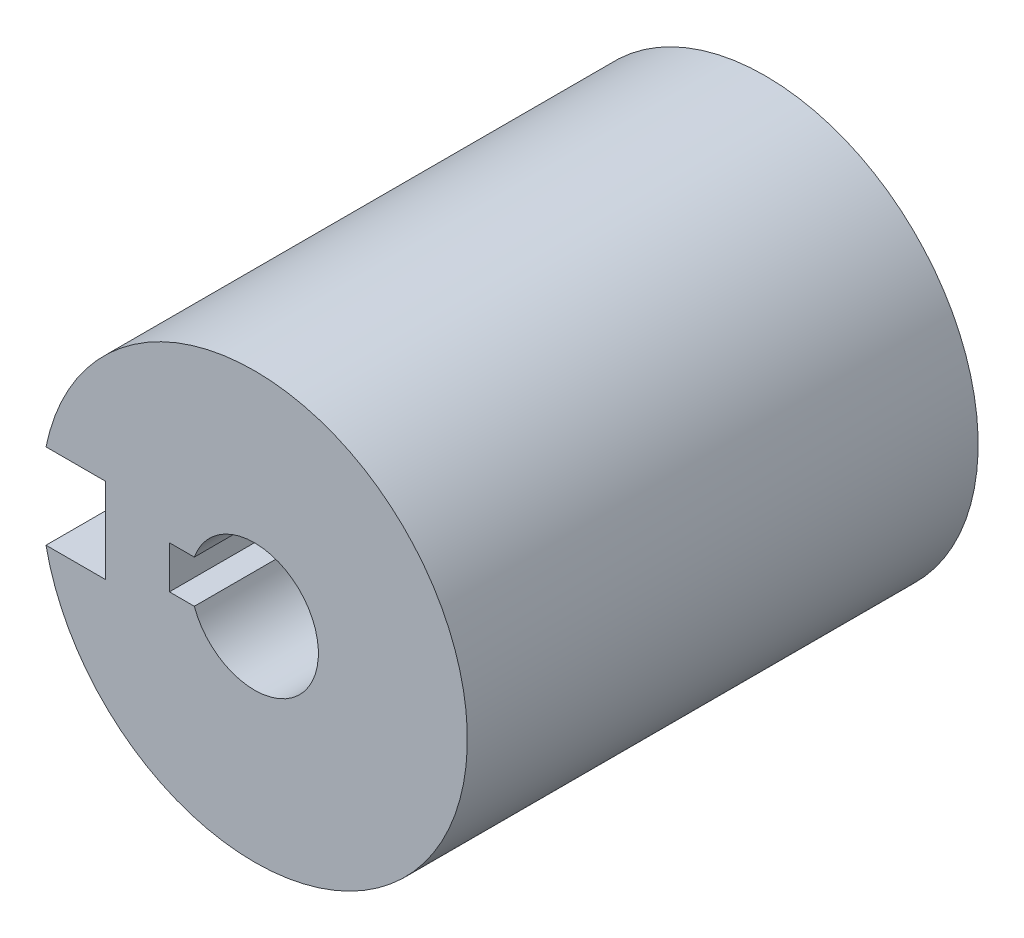
ISO-10303-21;
HEADER;
FILE_DESCRIPTION(('STEP AP214'),'2;1');
FILE_NAME('part.step','',(''),(''),'','','');
FILE_SCHEMA(('AUTOMOTIVE_DESIGN { 1 0 10303 214 1 1 1 1 }'));
ENDSEC;
DATA;
#1=APPLICATION_CONTEXT('core data for automotive mechanical design processes');
#2=APPLICATION_PROTOCOL_DEFINITION('international standard','automotive_design',2000,#1);
#3=PRODUCT_CONTEXT('',#1,'mechanical');
#4=PRODUCT('Part','Part','',(#3));
#5=PRODUCT_RELATED_PRODUCT_CATEGORY('part','',(#4));
#6=PRODUCT_DEFINITION_FORMATION('','',#4);
#7=PRODUCT_DEFINITION_CONTEXT('part definition',#1,'design');
#8=PRODUCT_DEFINITION('design','',#6,#7);
#9=PRODUCT_DEFINITION_SHAPE('','',#8);
#10=(LENGTH_UNIT() NAMED_UNIT(*) SI_UNIT(.MILLI.,.METRE.));
#11=(NAMED_UNIT(*) PLANE_ANGLE_UNIT() SI_UNIT($,.RADIAN.));
#12=(NAMED_UNIT(*) SI_UNIT($,.STERADIAN.) SOLID_ANGLE_UNIT());
#13=UNCERTAINTY_MEASURE_WITH_UNIT(LENGTH_MEASURE(1.E-05),#10,'distance_accuracy_value','');
#14=(GEOMETRIC_REPRESENTATION_CONTEXT(3) GLOBAL_UNCERTAINTY_ASSIGNED_CONTEXT((#13)) GLOBAL_UNIT_ASSIGNED_CONTEXT((#10,
#11,#12)) REPRESENTATION_CONTEXT('',''));
#15=CARTESIAN_POINT('',(0.,0.,0.));
#16=DIRECTION('',(0.,0.,1.));
#17=DIRECTION('',(1.,0.,0.));
#18=AXIS2_PLACEMENT_3D('',#15,#16,#17);
#19=CARTESIAN_POINT('',(0.,0.,12.));
#20=DIRECTION('',(0.,0.,1.));
#21=DIRECTION('',(1.,0.,0.));
#22=AXIS2_PLACEMENT_3D('',#19,#20,#21);
#23=PLANE('',#22);
#24=DIRECTION('',(1.,0.,0.));
#25=VECTOR('',#24,1.);
#26=CARTESIAN_POINT('',(0.,-1.,12.));
#27=LINE('',#26,#25);
#28=CARTESIAN_POINT('',(-4.89897948556636,-1.,12.));
#29=VERTEX_POINT('',#28);
#30=CARTESIAN_POINT('',(-3.5,-1.,12.));
#31=VERTEX_POINT('',#30);
#32=EDGE_CURVE('E124',#29,#31,#27,.T.);
#33=ORIENTED_EDGE('',*,*,#32,.F.);
#34=CARTESIAN_POINT('',(0.,0.,12.));
#35=DIRECTION('',(0.,0.,1.));
#36=DIRECTION('',(1.,0.,0.));
#37=AXIS2_PLACEMENT_3D('',#34,#35,#36);
#38=CIRCLE('',#37,5.);
#39=CARTESIAN_POINT('',(-4.89897948556636,1.,12.));
#40=VERTEX_POINT('',#39);
#41=EDGE_CURVE('E153',#29,#40,#38,.T.);
#42=ORIENTED_EDGE('',*,*,#41,.T.);
#43=DIRECTION('',(-1.,0.,0.));
#44=VECTOR('',#43,1.);
#45=CARTESIAN_POINT('',(0.,1.,12.));
#46=LINE('',#45,#44);
#47=CARTESIAN_POINT('',(-3.5,1.,12.));
#48=VERTEX_POINT('',#47);
#49=EDGE_CURVE('E48',#48,#40,#46,.T.);
#50=ORIENTED_EDGE('',*,*,#49,.F.);
#51=DIRECTION('',(0.,1.,0.));
#52=VECTOR('',#51,1.);
#53=CARTESIAN_POINT('',(-3.5,0.,12.));
#54=LINE('',#53,#52);
#55=EDGE_CURVE('E106',#31,#48,#54,.T.);
#56=ORIENTED_EDGE('',*,*,#55,.F.);
#57=EDGE_LOOP('',(#33,#42,#50,#56));
#58=FACE_BOUND('',#57,.T.);
#59=DIRECTION('',(1.,0.,0.));
#60=VECTOR('',#59,1.);
#61=CARTESIAN_POINT('',(-2.,-0.5,12.));
#62=LINE('',#61,#60);
#63=CARTESIAN_POINT('',(-2.,-0.5,12.));
#64=VERTEX_POINT('',#63);
#65=CARTESIAN_POINT('',(-1.4142135623731,-0.5,12.));
#66=VERTEX_POINT('',#65);
#67=EDGE_CURVE('E130',#64,#66,#62,.T.);
#68=ORIENTED_EDGE('',*,*,#67,.F.);
#69=DIRECTION('',(0.,-1.,0.));
#70=VECTOR('',#69,1.);
#71=CARTESIAN_POINT('',(-2.,0.5,12.));
#72=LINE('',#71,#70);
#73=CARTESIAN_POINT('',(-2.,0.5,12.));
#74=VERTEX_POINT('',#73);
#75=EDGE_CURVE('E138',#74,#64,#72,.T.);
#76=ORIENTED_EDGE('',*,*,#75,.F.);
#77=DIRECTION('',(-1.,0.,0.));
#78=VECTOR('',#77,1.);
#79=CARTESIAN_POINT('',(-2.,0.5,12.));
#80=LINE('',#79,#78);
#81=CARTESIAN_POINT('',(-1.4142135623731,0.5,12.));
#82=VERTEX_POINT('',#81);
#83=EDGE_CURVE('E127',#82,#74,#80,.T.);
#84=ORIENTED_EDGE('',*,*,#83,.F.);
#85=CARTESIAN_POINT('',(0.,0.,12.));
#86=DIRECTION('',(0.,0.,1.));
#87=DIRECTION('',(1.,0.,0.));
#88=AXIS2_PLACEMENT_3D('',#85,#86,#87);
#89=CIRCLE('',#88,1.5);
#90=EDGE_CURVE('E147',#66,#82,#89,.T.);
#91=ORIENTED_EDGE('',*,*,#90,.F.);
#92=EDGE_LOOP('',(#68,#76,#84,#91));
#93=FACE_BOUND('',#92,.T.);
#94=ADVANCED_FACE('F33',(#58,#93),#23,.T.);
#95=CARTESIAN_POINT('',(0.,0.,0.));
#96=DIRECTION('',(0.,0.,1.));
#97=DIRECTION('',(1.,0.,0.));
#98=AXIS2_PLACEMENT_3D('',#95,#96,#97);
#99=PLANE('',#98);
#100=CARTESIAN_POINT('',(0.,0.,0.));
#101=DIRECTION('',(0.,0.,1.));
#102=DIRECTION('',(1.,0.,0.));
#103=AXIS2_PLACEMENT_3D('',#100,#101,#102);
#104=CIRCLE('',#103,5.);
#105=CARTESIAN_POINT('',(-4.89897948556636,-1.,0.));
#106=VERTEX_POINT('',#105);
#107=CARTESIAN_POINT('',(-4.89897948556636,1.,0.));
#108=VERTEX_POINT('',#107);
#109=EDGE_CURVE('E150',#106,#108,#104,.T.);
#110=ORIENTED_EDGE('',*,*,#109,.F.);
#111=DIRECTION('',(-1.,0.,0.));
#112=VECTOR('',#111,1.);
#113=CARTESIAN_POINT('',(-3.5,-1.,0.));
#114=LINE('',#113,#112);
#115=CARTESIAN_POINT('',(-3.5,-1.,0.));
#116=VERTEX_POINT('',#115);
#117=EDGE_CURVE('E108',#116,#106,#114,.T.);
#118=ORIENTED_EDGE('',*,*,#117,.F.);
#119=DIRECTION('',(0.,-1.,0.));
#120=VECTOR('',#119,1.);
#121=CARTESIAN_POINT('',(-3.5,1.,0.));
#122=LINE('',#121,#120);
#123=CARTESIAN_POINT('',(-3.5,1.,0.));
#124=VERTEX_POINT('',#123);
#125=EDGE_CURVE('E103',#124,#116,#122,.T.);
#126=ORIENTED_EDGE('',*,*,#125,.F.);
#127=DIRECTION('',(1.,0.,0.));
#128=VECTOR('',#127,1.);
#129=CARTESIAN_POINT('',(-3.5,1.,0.));
#130=LINE('',#129,#128);
#131=EDGE_CURVE('E111',#108,#124,#130,.T.);
#132=ORIENTED_EDGE('',*,*,#131,.F.);
#133=EDGE_LOOP('',(#110,#118,#126,#132));
#134=FACE_BOUND('',#133,.T.);
#135=DIRECTION('',(0.,-1.,0.));
#136=VECTOR('',#135,1.);
#137=CARTESIAN_POINT('',(-2.,0.5,0.));
#138=LINE('',#137,#136);
#139=CARTESIAN_POINT('',(-2.,0.5,0.));
#140=VERTEX_POINT('',#139);
#141=CARTESIAN_POINT('',(-2.,-0.5,0.));
#142=VERTEX_POINT('',#141);
#143=EDGE_CURVE('E129',#140,#142,#138,.T.);
#144=ORIENTED_EDGE('',*,*,#143,.T.);
#145=DIRECTION('',(1.,0.,0.));
#146=VECTOR('',#145,1.);
#147=CARTESIAN_POINT('',(-2.,-0.5,0.));
#148=LINE('',#147,#146);
#149=CARTESIAN_POINT('',(-1.4142135623731,-0.5,0.));
#150=VERTEX_POINT('',#149);
#151=EDGE_CURVE('E133',#142,#150,#148,.T.);
#152=ORIENTED_EDGE('',*,*,#151,.T.);
#153=CARTESIAN_POINT('',(0.,0.,0.));
#154=DIRECTION('',(0.,0.,1.));
#155=DIRECTION('',(1.,0.,0.));
#156=AXIS2_PLACEMENT_3D('',#153,#154,#155);
#157=CIRCLE('',#156,1.5);
#158=CARTESIAN_POINT('',(-1.4142135623731,0.5,0.));
#159=VERTEX_POINT('',#158);
#160=EDGE_CURVE('E144',#150,#159,#157,.T.);
#161=ORIENTED_EDGE('',*,*,#160,.T.);
#162=DIRECTION('',(-1.,0.,0.));
#163=VECTOR('',#162,1.);
#164=CARTESIAN_POINT('',(-2.,0.5,0.));
#165=LINE('',#164,#163);
#166=EDGE_CURVE('E56',#159,#140,#165,.T.);
#167=ORIENTED_EDGE('',*,*,#166,.T.);
#168=EDGE_LOOP('',(#144,#152,#161,#167));
#169=FACE_BOUND('',#168,.T.);
#170=ADVANCED_FACE('F117',(#134,#169),#99,.F.);
#171=CARTESIAN_POINT('',(0.,0.,12.));
#172=DIRECTION('',(0.,0.,-1.));
#173=DIRECTION('',(-1.,0.,0.));
#174=AXIS2_PLACEMENT_3D('',#171,#172,#173);
#175=CYLINDRICAL_SURFACE('',#174,5.);
#176=ORIENTED_EDGE('',*,*,#41,.F.);
#177=DIRECTION('',(0.,0.,-1.));
#178=VECTOR('',#177,1.);
#179=CARTESIAN_POINT('',(-4.89897948556636,-1.,12.));
#180=LINE('',#179,#178);
#181=EDGE_CURVE('E11',#29,#106,#180,.T.);
#182=ORIENTED_EDGE('',*,*,#181,.T.);
#183=ORIENTED_EDGE('',*,*,#109,.T.);
#184=DIRECTION('',(0.,0.,-1.));
#185=VECTOR('',#184,1.);
#186=CARTESIAN_POINT('',(-4.89897948556636,1.,12.));
#187=LINE('',#186,#185);
#188=EDGE_CURVE('E41',#108,#40,#187,.F.);
#189=ORIENTED_EDGE('',*,*,#188,.T.);
#190=EDGE_LOOP('',(#176,#182,#183,#189));
#191=FACE_BOUND('',#190,.T.);
#192=ADVANCED_FACE('F35',(#191),#175,.T.);
#193=CARTESIAN_POINT('',(0.,0.,12.));
#194=DIRECTION('',(0.,0.,-1.));
#195=DIRECTION('',(-1.,0.,0.));
#196=AXIS2_PLACEMENT_3D('',#193,#194,#195);
#197=CYLINDRICAL_SURFACE('',#196,1.5);
#198=DIRECTION('',(0.,0.,-1.));
#199=VECTOR('',#198,1.);
#200=CARTESIAN_POINT('',(-1.4142135623731,-0.5,12.));
#201=LINE('',#200,#199);
#202=EDGE_CURVE('E159',#66,#150,#201,.T.);
#203=ORIENTED_EDGE('',*,*,#202,.F.);
#204=ORIENTED_EDGE('',*,*,#90,.T.);
#205=DIRECTION('',(0.,0.,-1.));
#206=VECTOR('',#205,1.);
#207=CARTESIAN_POINT('',(-1.4142135623731,0.5,12.));
#208=LINE('',#207,#206);
#209=EDGE_CURVE('E156',#159,#82,#208,.F.);
#210=ORIENTED_EDGE('',*,*,#209,.F.);
#211=ORIENTED_EDGE('',*,*,#160,.F.);
#212=EDGE_LOOP('',(#203,#204,#210,#211));
#213=FACE_BOUND('',#212,.T.);
#214=ADVANCED_FACE('F183',(#213),#197,.F.);
#215=CARTESIAN_POINT('',(-2.,-0.5,0.));
#216=DIRECTION('',(0.,-1.,0.));
#217=DIRECTION('',(0.,0.,-1.));
#218=AXIS2_PLACEMENT_3D('',#215,#216,#217);
#219=PLANE('',#218);
#220=ORIENTED_EDGE('',*,*,#202,.T.);
#221=ORIENTED_EDGE('',*,*,#151,.F.);
#222=DIRECTION('',(0.,0.,1.));
#223=VECTOR('',#222,1.);
#224=CARTESIAN_POINT('',(-2.,-0.5,0.));
#225=LINE('',#224,#223);
#226=EDGE_CURVE('E142',#142,#64,#225,.T.);
#227=ORIENTED_EDGE('',*,*,#226,.T.);
#228=ORIENTED_EDGE('',*,*,#67,.T.);
#229=EDGE_LOOP('',(#220,#221,#227,#228));
#230=FACE_BOUND('',#229,.T.);
#231=ADVANCED_FACE('F185',(#230),#219,.F.);
#232=CARTESIAN_POINT('',(-2.,0.5,0.));
#233=DIRECTION('',(-1.,0.,0.));
#234=DIRECTION('',(0.,0.,1.));
#235=AXIS2_PLACEMENT_3D('',#232,#233,#234);
#236=PLANE('',#235);
#237=ORIENTED_EDGE('',*,*,#75,.T.);
#238=ORIENTED_EDGE('',*,*,#226,.F.);
#239=ORIENTED_EDGE('',*,*,#143,.F.);
#240=DIRECTION('',(0.,0.,1.));
#241=VECTOR('',#240,1.);
#242=CARTESIAN_POINT('',(-2.,0.5,0.));
#243=LINE('',#242,#241);
#244=EDGE_CURVE('E136',#140,#74,#243,.T.);
#245=ORIENTED_EDGE('',*,*,#244,.T.);
#246=EDGE_LOOP('',(#237,#238,#239,#245));
#247=FACE_BOUND('',#246,.T.);
#248=ADVANCED_FACE('F175',(#247),#236,.F.);
#249=CARTESIAN_POINT('',(-2.,0.5,0.));
#250=DIRECTION('',(0.,1.,0.));
#251=DIRECTION('',(0.,0.,1.));
#252=AXIS2_PLACEMENT_3D('',#249,#250,#251);
#253=PLANE('',#252);
#254=ORIENTED_EDGE('',*,*,#209,.T.);
#255=ORIENTED_EDGE('',*,*,#83,.T.);
#256=ORIENTED_EDGE('',*,*,#244,.F.);
#257=ORIENTED_EDGE('',*,*,#166,.F.);
#258=EDGE_LOOP('',(#254,#255,#256,#257));
#259=FACE_BOUND('',#258,.T.);
#260=ADVANCED_FACE('F168',(#259),#253,.F.);
#261=CARTESIAN_POINT('',(-3.5,-1.,15.));
#262=DIRECTION('',(0.,-1.,0.));
#263=DIRECTION('',(0.,0.,-1.));
#264=AXIS2_PLACEMENT_3D('',#261,#262,#263);
#265=PLANE('',#264);
#266=ORIENTED_EDGE('',*,*,#32,.T.);
#267=DIRECTION('',(0.,0.,-1.));
#268=VECTOR('',#267,1.);
#269=CARTESIAN_POINT('',(-3.5,-1.,15.));
#270=LINE('',#269,#268);
#271=EDGE_CURVE('E107',#31,#116,#270,.T.);
#272=ORIENTED_EDGE('',*,*,#271,.T.);
#273=ORIENTED_EDGE('',*,*,#117,.T.);
#274=ORIENTED_EDGE('',*,*,#181,.F.);
#275=EDGE_LOOP('',(#266,#272,#273,#274));
#276=FACE_BOUND('',#275,.T.);
#277=ADVANCED_FACE('F166',(#276),#265,.F.);
#278=CARTESIAN_POINT('',(-3.5,1.,15.));
#279=DIRECTION('',(1.,0.,0.));
#280=DIRECTION('',(0.,0.,-1.));
#281=AXIS2_PLACEMENT_3D('',#278,#279,#280);
#282=PLANE('',#281);
#283=ORIENTED_EDGE('',*,*,#55,.T.);
#284=DIRECTION('',(0.,0.,-1.));
#285=VECTOR('',#284,1.);
#286=CARTESIAN_POINT('',(-3.5,1.,15.));
#287=LINE('',#286,#285);
#288=EDGE_CURVE('E98',#48,#124,#287,.T.);
#289=ORIENTED_EDGE('',*,*,#288,.T.);
#290=ORIENTED_EDGE('',*,*,#125,.T.);
#291=ORIENTED_EDGE('',*,*,#271,.F.);
#292=EDGE_LOOP('',(#283,#289,#290,#291));
#293=FACE_BOUND('',#292,.T.);
#294=ADVANCED_FACE('F100',(#293),#282,.F.);
#295=CARTESIAN_POINT('',(-3.5,1.,15.));
#296=DIRECTION('',(0.,1.,0.));
#297=DIRECTION('',(0.,0.,1.));
#298=AXIS2_PLACEMENT_3D('',#295,#296,#297);
#299=PLANE('',#298);
#300=ORIENTED_EDGE('',*,*,#49,.T.);
#301=ORIENTED_EDGE('',*,*,#188,.F.);
#302=ORIENTED_EDGE('',*,*,#131,.T.);
#303=ORIENTED_EDGE('',*,*,#288,.F.);
#304=EDGE_LOOP('',(#300,#301,#302,#303));
#305=FACE_BOUND('',#304,.T.);
#306=ADVANCED_FACE('F112',(#305),#299,.F.);
#307=CLOSED_SHELL('',(#94,#170,#192,#214,#231,#248,#260,#277,#294,#306));
#308=MANIFOLD_SOLID_BREP('B2',#307);
#309=ADVANCED_BREP_SHAPE_REPRESENTATION('',(#18,#308),#14);
#310=SHAPE_DEFINITION_REPRESENTATION(#9,#309);
ENDSEC;
END-ISO-10303-21;
